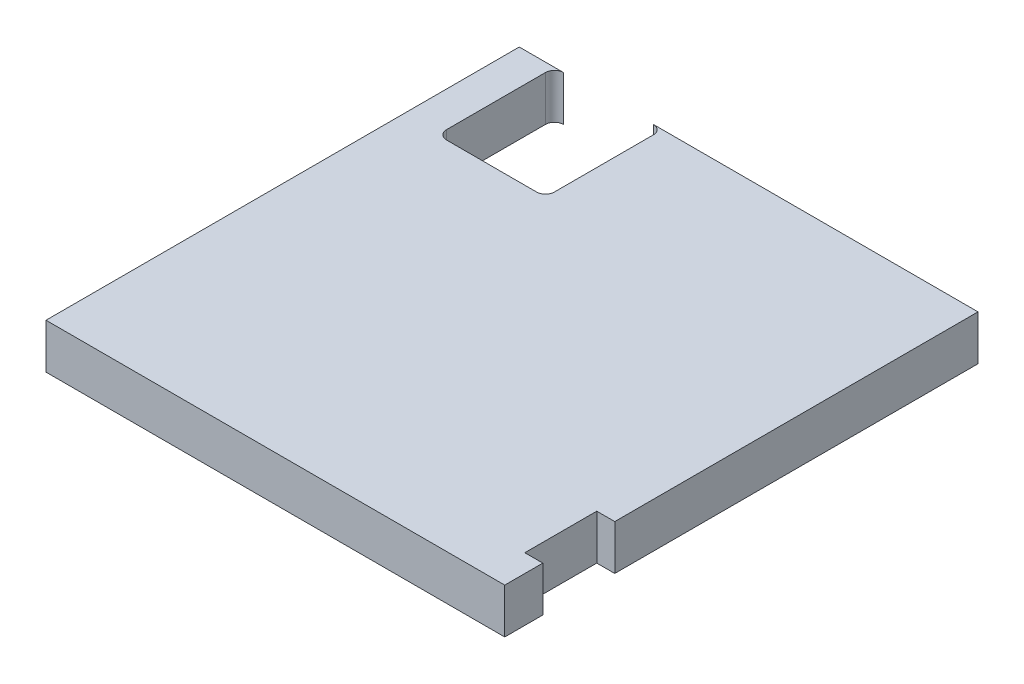
ISO-10303-21;
HEADER;
FILE_DESCRIPTION(('STEP AP214'),'2;1');
FILE_NAME('part.step','',(''),(''),'','','');
FILE_SCHEMA(('AUTOMOTIVE_DESIGN { 1 0 10303 214 1 1 1 1 }'));
ENDSEC;
DATA;
#1=APPLICATION_CONTEXT('core data for automotive mechanical design processes');
#2=APPLICATION_PROTOCOL_DEFINITION('international standard','automotive_design',2000,#1);
#3=PRODUCT_CONTEXT('',#1,'mechanical');
#4=PRODUCT('Part','Part','',(#3));
#5=PRODUCT_RELATED_PRODUCT_CATEGORY('part','',(#4));
#6=PRODUCT_DEFINITION_FORMATION('','',#4);
#7=PRODUCT_DEFINITION_CONTEXT('part definition',#1,'design');
#8=PRODUCT_DEFINITION('design','',#6,#7);
#9=PRODUCT_DEFINITION_SHAPE('','',#8);
#10=(LENGTH_UNIT() NAMED_UNIT(*) SI_UNIT(.MILLI.,.METRE.));
#11=(NAMED_UNIT(*) PLANE_ANGLE_UNIT() SI_UNIT($,.RADIAN.));
#12=(NAMED_UNIT(*) SI_UNIT($,.STERADIAN.) SOLID_ANGLE_UNIT());
#13=UNCERTAINTY_MEASURE_WITH_UNIT(LENGTH_MEASURE(1.E-05),#10,'distance_accuracy_value','');
#14=(GEOMETRIC_REPRESENTATION_CONTEXT(3) GLOBAL_UNCERTAINTY_ASSIGNED_CONTEXT((#13)) GLOBAL_UNIT_ASSIGNED_CONTEXT((#10,
#11,#12)) REPRESENTATION_CONTEXT('',''));
#15=CARTESIAN_POINT('',(0.,0.,0.));
#16=DIRECTION('',(0.,0.,1.));
#17=DIRECTION('',(1.,0.,0.));
#18=AXIS2_PLACEMENT_3D('',#15,#16,#17);
#19=CARTESIAN_POINT('',(0.,0.,-7.61333347303129));
#20=DIRECTION('',(0.,0.,1.));
#21=DIRECTION('',(1.,0.,0.));
#22=AXIS2_PLACEMENT_3D('',#19,#20,#21);
#23=PLANE('',#22);
#24=DIRECTION('',(1.,0.,0.));
#25=VECTOR('',#24,1.);
#26=CARTESIAN_POINT('',(57.5,-23.5,-7.61333347303129));
#27=LINE('',#26,#25);
#28=CARTESIAN_POINT('',(-27.5859247307322,-23.5,-7.61333347303129));
#29=VERTEX_POINT('',#28);
#30=CARTESIAN_POINT('',(8.5,-23.5,-7.61333347303129));
#31=VERTEX_POINT('',#30);
#32=EDGE_CURVE('E200',#29,#31,#27,.T.);
#33=ORIENTED_EDGE('',*,*,#32,.T.);
#34=DIRECTION('',(0.,-1.,0.));
#35=VECTOR('',#34,1.);
#36=CARTESIAN_POINT('',(8.5,0.,-7.61333347303129));
#37=LINE('',#36,#35);
#38=CARTESIAN_POINT('',(8.5,-28.5,-7.61333347303129));
#39=VERTEX_POINT('',#38);
#40=EDGE_CURVE('E37',#31,#39,#37,.T.);
#41=ORIENTED_EDGE('',*,*,#40,.T.);
#42=DIRECTION('',(-1.,0.,0.));
#43=VECTOR('',#42,1.);
#44=CARTESIAN_POINT('',(0.,-28.5,-7.61333347303129));
#45=LINE('',#44,#43);
#46=CARTESIAN_POINT('',(-27.5859247307322,-28.5,-7.61333347303129));
#47=VERTEX_POINT('',#46);
#48=EDGE_CURVE('E163',#39,#47,#45,.T.);
#49=ORIENTED_EDGE('',*,*,#48,.T.);
#50=DIRECTION('',(0.,1.,0.));
#51=VECTOR('',#50,1.);
#52=CARTESIAN_POINT('',(-27.5859247307322,-23.5,-7.61333347303129));
#53=LINE('',#52,#51);
#54=EDGE_CURVE('E151',#47,#29,#53,.T.);
#55=ORIENTED_EDGE('',*,*,#54,.T.);
#56=EDGE_LOOP('',(#33,#41,#49,#55));
#57=FACE_BOUND('',#56,.T.);
#58=ADVANCED_FACE('F33',(#57),#23,.F.);
#59=CARTESIAN_POINT('',(8.5,0.,0.));
#60=DIRECTION('',(-1.,0.,0.));
#61=DIRECTION('',(0.,0.,1.));
#62=AXIS2_PLACEMENT_3D('',#59,#60,#61);
#63=PLANE('',#62);
#64=DIRECTION('',(0.,0.,1.));
#65=VECTOR('',#64,1.);
#66=CARTESIAN_POINT('',(8.5,-23.5,-45.));
#67=LINE('',#66,#65);
#68=CARTESIAN_POINT('',(8.5,-23.5,32.7691840241398));
#69=VERTEX_POINT('',#68);
#70=EDGE_CURVE('E196',#31,#69,#67,.T.);
#71=ORIENTED_EDGE('',*,*,#70,.T.);
#72=DIRECTION('',(0.,-1.,0.));
#73=VECTOR('',#72,1.);
#74=CARTESIAN_POINT('',(8.5,-28.5,32.7691840241398));
#75=LINE('',#74,#73);
#76=CARTESIAN_POINT('',(8.5,-28.5,32.7691840241398));
#77=VERTEX_POINT('',#76);
#78=EDGE_CURVE('E168',#69,#77,#75,.T.);
#79=ORIENTED_EDGE('',*,*,#78,.T.);
#80=DIRECTION('',(0.,0.,-1.));
#81=VECTOR('',#80,1.);
#82=CARTESIAN_POINT('',(8.5,-28.5,0.));
#83=LINE('',#82,#81);
#84=EDGE_CURVE('E230',#77,#39,#83,.T.);
#85=ORIENTED_EDGE('',*,*,#84,.T.);
#86=ORIENTED_EDGE('',*,*,#40,.F.);
#87=EDGE_LOOP('',(#71,#79,#85,#86));
#88=FACE_BOUND('',#87,.T.);
#89=ADVANCED_FACE('F305',(#88),#63,.F.);
#90=CARTESIAN_POINT('',(8.5,-23.5,40.7691840241398));
#91=VERTEX_POINT('',#90);
#92=CARTESIAN_POINT('',(8.5,-23.5,45.));
#93=VERTEX_POINT('',#92);
#94=EDGE_CURVE('E231',#91,#93,#67,.T.);
#95=ORIENTED_EDGE('',*,*,#94,.T.);
#96=DIRECTION('',(0.,-1.,0.));
#97=VECTOR('',#96,1.);
#98=CARTESIAN_POINT('',(8.5,-23.5,45.));
#99=LINE('',#98,#97);
#100=CARTESIAN_POINT('',(8.5,-28.5,45.));
#101=VERTEX_POINT('',#100);
#102=EDGE_CURVE('E197',#93,#101,#99,.T.);
#103=ORIENTED_EDGE('',*,*,#102,.T.);
#104=CARTESIAN_POINT('',(8.5,-28.5,40.7691840241398));
#105=VERTEX_POINT('',#104);
#106=EDGE_CURVE('E193',#101,#105,#83,.T.);
#107=ORIENTED_EDGE('',*,*,#106,.T.);
#108=DIRECTION('',(0.,-1.,0.));
#109=VECTOR('',#108,1.);
#110=CARTESIAN_POINT('',(8.5,-28.5,40.7691840241398));
#111=LINE('',#110,#109);
#112=EDGE_CURVE('E190',#91,#105,#111,.T.);
#113=ORIENTED_EDGE('',*,*,#112,.F.);
#114=EDGE_LOOP('',(#95,#103,#107,#113));
#115=FACE_BOUND('',#114,.T.);
#116=ADVANCED_FACE('F292',(#115),#63,.F.);
#117=DIRECTION('',(0.,1.,0.));
#118=VECTOR('',#117,1.);
#119=CARTESIAN_POINT('',(-37.5859247307322,-28.5,-7.61333347303129));
#120=LINE('',#119,#118);
#121=CARTESIAN_POINT('',(-37.5859247307322,-23.5,-7.61333347303129));
#122=VERTEX_POINT('',#121);
#123=CARTESIAN_POINT('',(-37.5859247307322,-28.5,-7.61333347303129));
#124=VERTEX_POINT('',#123);
#125=EDGE_CURVE('E160',#122,#124,#120,.F.);
#126=ORIENTED_EDGE('',*,*,#125,.T.);
#127=CARTESIAN_POINT('',(-42.5,-28.5,-7.61333347303129));
#128=VERTEX_POINT('',#127);
#129=EDGE_CURVE('E167',#124,#128,#45,.T.);
#130=ORIENTED_EDGE('',*,*,#129,.T.);
#131=DIRECTION('',(0.,1.,0.));
#132=VECTOR('',#131,1.);
#133=CARTESIAN_POINT('',(-42.5,-18.5,-7.61333347303129));
#134=LINE('',#133,#132);
#135=CARTESIAN_POINT('',(-42.5,-23.5,-7.61333347303129));
#136=VERTEX_POINT('',#135);
#137=EDGE_CURVE('E201',#128,#136,#134,.T.);
#138=ORIENTED_EDGE('',*,*,#137,.T.);
#139=EDGE_CURVE('E228',#136,#122,#27,.T.);
#140=ORIENTED_EDGE('',*,*,#139,.T.);
#141=EDGE_LOOP('',(#126,#130,#138,#140));
#142=FACE_BOUND('',#141,.T.);
#143=ADVANCED_FACE('F239',(#142),#23,.F.);
#144=CARTESIAN_POINT('',(0.,-28.5,32.7691840241398));
#145=DIRECTION('',(0.,0.,1.));
#146=DIRECTION('',(1.,0.,0.));
#147=AXIS2_PLACEMENT_3D('',#144,#145,#146);
#148=PLANE('',#147);
#149=ORIENTED_EDGE('',*,*,#78,.F.);
#150=DIRECTION('',(1.,0.,0.));
#151=VECTOR('',#150,1.);
#152=CARTESIAN_POINT('',(0.,-23.5,32.7691840241398));
#153=LINE('',#152,#151);
#154=CARTESIAN_POINT('',(6.5,-23.5,32.7691840241398));
#155=VERTEX_POINT('',#154);
#156=EDGE_CURVE('E205',#155,#69,#153,.T.);
#157=ORIENTED_EDGE('',*,*,#156,.F.);
#158=DIRECTION('',(0.,1.,0.));
#159=VECTOR('',#158,1.);
#160=CARTESIAN_POINT('',(6.5,-28.5,32.7691840241398));
#161=LINE('',#160,#159);
#162=CARTESIAN_POINT('',(6.5,-28.5,32.7691840241398));
#163=VERTEX_POINT('',#162);
#164=EDGE_CURVE('E254',#163,#155,#161,.T.);
#165=ORIENTED_EDGE('',*,*,#164,.F.);
#166=DIRECTION('',(1.,0.,0.));
#167=VECTOR('',#166,1.);
#168=CARTESIAN_POINT('',(0.,-28.5,32.7691840241398));
#169=LINE('',#168,#167);
#170=EDGE_CURVE('E212',#163,#77,#169,.T.);
#171=ORIENTED_EDGE('',*,*,#170,.T.);
#172=EDGE_LOOP('',(#149,#157,#165,#171));
#173=FACE_BOUND('',#172,.T.);
#174=ADVANCED_FACE('F303',(#173),#148,.T.);
#175=CARTESIAN_POINT('',(-37.5859247307322,-28.5,4.38666652696871));
#176=DIRECTION('',(0.,-1.,0.));
#177=DIRECTION('',(0.,0.,-1.));
#178=AXIS2_PLACEMENT_3D('',#175,#176,#177);
#179=CYLINDRICAL_SURFACE('',#178,1.);
#180=CARTESIAN_POINT('',(-37.5859247307322,-28.5,4.38666652696871));
#181=DIRECTION('',(0.,-1.,0.));
#182=DIRECTION('',(0.,0.,-1.));
#183=AXIS2_PLACEMENT_3D('',#180,#181,#182);
#184=CIRCLE('',#183,1.);
#185=CARTESIAN_POINT('',(-38.5859247307322,-28.5,4.38666652696871));
#186=VERTEX_POINT('',#185);
#187=CARTESIAN_POINT('',(-37.5859247307322,-28.5,5.38666652696871));
#188=VERTEX_POINT('',#187);
#189=EDGE_CURVE('E184',#186,#188,#184,.F.);
#190=ORIENTED_EDGE('',*,*,#189,.F.);
#191=DIRECTION('',(0.,1.,0.));
#192=VECTOR('',#191,1.);
#193=CARTESIAN_POINT('',(-38.5859247307322,-28.5,4.38666652696871));
#194=LINE('',#193,#192);
#195=CARTESIAN_POINT('',(-38.5859247307322,-23.5,4.38666652696871));
#196=VERTEX_POINT('',#195);
#197=EDGE_CURVE('E58',#196,#186,#194,.F.);
#198=ORIENTED_EDGE('',*,*,#197,.F.);
#199=CARTESIAN_POINT('',(-37.5859247307322,-23.5,4.38666652696871));
#200=DIRECTION('',(0.,1.,0.));
#201=DIRECTION('',(0.,0.,1.));
#202=AXIS2_PLACEMENT_3D('',#199,#200,#201);
#203=CIRCLE('',#202,1.);
#204=CARTESIAN_POINT('',(-37.5859247307322,-23.5,5.38666652696871));
#205=VERTEX_POINT('',#204);
#206=EDGE_CURVE('E182',#205,#196,#203,.F.);
#207=ORIENTED_EDGE('',*,*,#206,.F.);
#208=DIRECTION('',(0.,1.,0.));
#209=VECTOR('',#208,1.);
#210=CARTESIAN_POINT('',(-37.5859247307322,-23.5,5.38666652696871));
#211=LINE('',#210,#209);
#212=EDGE_CURVE('E270',#188,#205,#211,.T.);
#213=ORIENTED_EDGE('',*,*,#212,.F.);
#214=EDGE_LOOP('',(#190,#198,#207,#213));
#215=FACE_BOUND('',#214,.T.);
#216=ADVANCED_FACE('F319',(#215),#179,.F.);
#217=CARTESIAN_POINT('',(0.,-28.5,5.38666652696871));
#218=DIRECTION('',(0.,0.,1.));
#219=DIRECTION('',(1.,0.,0.));
#220=AXIS2_PLACEMENT_3D('',#217,#218,#219);
#221=PLANE('',#220);
#222=DIRECTION('',(1.,0.,0.));
#223=VECTOR('',#222,1.);
#224=CARTESIAN_POINT('',(0.,-23.5,5.38666652696871));
#225=LINE('',#224,#223);
#226=CARTESIAN_POINT('',(-27.5859247307322,-23.5,5.38666652696871));
#227=VERTEX_POINT('',#226);
#228=EDGE_CURVE('E253',#205,#227,#225,.T.);
#229=ORIENTED_EDGE('',*,*,#228,.T.);
#230=DIRECTION('',(0.,1.,0.));
#231=VECTOR('',#230,1.);
#232=CARTESIAN_POINT('',(-27.5859247307322,-28.5,5.38666652696871));
#233=LINE('',#232,#231);
#234=CARTESIAN_POINT('',(-27.5859247307322,-28.5,5.38666652696871));
#235=VERTEX_POINT('',#234);
#236=EDGE_CURVE('E273',#227,#235,#233,.F.);
#237=ORIENTED_EDGE('',*,*,#236,.T.);
#238=DIRECTION('',(1.,0.,0.));
#239=VECTOR('',#238,1.);
#240=CARTESIAN_POINT('',(0.,-28.5,5.38666652696871));
#241=LINE('',#240,#239);
#242=EDGE_CURVE('E278',#188,#235,#241,.T.);
#243=ORIENTED_EDGE('',*,*,#242,.F.);
#244=ORIENTED_EDGE('',*,*,#212,.T.);
#245=EDGE_LOOP('',(#229,#237,#243,#244));
#246=FACE_BOUND('',#245,.T.);
#247=ADVANCED_FACE('F315',(#246),#221,.F.);
#248=CARTESIAN_POINT('',(-27.5859247307322,-28.5,4.38666652696871));
#249=DIRECTION('',(0.,1.,0.));
#250=DIRECTION('',(0.,0.,1.));
#251=AXIS2_PLACEMENT_3D('',#248,#249,#250);
#252=CYLINDRICAL_SURFACE('',#251,1.);
#253=CARTESIAN_POINT('',(-27.5859247307322,-28.5,4.38666652696871));
#254=DIRECTION('',(0.,-1.,0.));
#255=DIRECTION('',(0.,0.,-1.));
#256=AXIS2_PLACEMENT_3D('',#253,#254,#255);
#257=CIRCLE('',#256,1.);
#258=CARTESIAN_POINT('',(-26.5859247307322,-28.5,4.38666652696871));
#259=VERTEX_POINT('',#258);
#260=EDGE_CURVE('E176',#235,#259,#257,.F.);
#261=ORIENTED_EDGE('',*,*,#260,.F.);
#262=ORIENTED_EDGE('',*,*,#236,.F.);
#263=CARTESIAN_POINT('',(-27.5859247307322,-23.5,4.38666652696871));
#264=DIRECTION('',(0.,1.,0.));
#265=DIRECTION('',(0.,0.,1.));
#266=AXIS2_PLACEMENT_3D('',#263,#264,#265);
#267=CIRCLE('',#266,1.);
#268=CARTESIAN_POINT('',(-26.5859247307322,-23.5,4.38666652696871));
#269=VERTEX_POINT('',#268);
#270=EDGE_CURVE('E174',#269,#227,#267,.F.);
#271=ORIENTED_EDGE('',*,*,#270,.F.);
#272=DIRECTION('',(0.,1.,0.));
#273=VECTOR('',#272,1.);
#274=CARTESIAN_POINT('',(-26.5859247307322,-28.5,4.38666652696871));
#275=LINE('',#274,#273);
#276=EDGE_CURVE('E217',#259,#269,#275,.T.);
#277=ORIENTED_EDGE('',*,*,#276,.F.);
#278=EDGE_LOOP('',(#261,#262,#271,#277));
#279=FACE_BOUND('',#278,.T.);
#280=ADVANCED_FACE('F312',(#279),#252,.F.);
#281=CARTESIAN_POINT('',(-38.5859247307322,-28.5,0.));
#282=DIRECTION('',(-1.,0.,0.));
#283=DIRECTION('',(0.,0.,1.));
#284=AXIS2_PLACEMENT_3D('',#281,#282,#283);
#285=PLANE('',#284);
#286=DIRECTION('',(0.,0.,1.));
#287=VECTOR('',#286,1.);
#288=CARTESIAN_POINT('',(-38.5859247307322,-23.5,0.));
#289=LINE('',#288,#287);
#290=CARTESIAN_POINT('',(-38.5859247307322,-23.5,-6.61333347303129));
#291=VERTEX_POINT('',#290);
#292=EDGE_CURVE('E251',#291,#196,#289,.T.);
#293=ORIENTED_EDGE('',*,*,#292,.T.);
#294=ORIENTED_EDGE('',*,*,#197,.T.);
#295=DIRECTION('',(0.,0.,1.));
#296=VECTOR('',#295,1.);
#297=CARTESIAN_POINT('',(-38.5859247307322,-28.5,0.));
#298=LINE('',#297,#296);
#299=CARTESIAN_POINT('',(-38.5859247307322,-28.5,-6.61333347303129));
#300=VERTEX_POINT('',#299);
#301=EDGE_CURVE('E265',#300,#186,#298,.T.);
#302=ORIENTED_EDGE('',*,*,#301,.F.);
#303=DIRECTION('',(0.,1.,0.));
#304=VECTOR('',#303,1.);
#305=CARTESIAN_POINT('',(-38.5859247307322,-28.5,-6.61333347303129));
#306=LINE('',#305,#304);
#307=EDGE_CURVE('E275',#300,#291,#306,.T.);
#308=ORIENTED_EDGE('',*,*,#307,.T.);
#309=EDGE_LOOP('',(#293,#294,#302,#308));
#310=FACE_BOUND('',#309,.T.);
#311=ADVANCED_FACE('F276',(#310),#285,.F.);
#312=CARTESIAN_POINT('',(-26.5859247307322,-28.5,0.));
#313=DIRECTION('',(-1.,0.,0.));
#314=DIRECTION('',(0.,0.,1.));
#315=AXIS2_PLACEMENT_3D('',#312,#313,#314);
#316=PLANE('',#315);
#317=DIRECTION('',(0.,0.,1.));
#318=VECTOR('',#317,1.);
#319=CARTESIAN_POINT('',(-26.5859247307322,-23.5,0.));
#320=LINE('',#319,#318);
#321=CARTESIAN_POINT('',(-26.5859247307322,-23.5,-6.61333347303129));
#322=VERTEX_POINT('',#321);
#323=EDGE_CURVE('E257',#322,#269,#320,.T.);
#324=ORIENTED_EDGE('',*,*,#323,.F.);
#325=DIRECTION('',(0.,1.,0.));
#326=VECTOR('',#325,1.);
#327=CARTESIAN_POINT('',(-26.5859247307322,-28.5,-6.61333347303129));
#328=LINE('',#327,#326);
#329=CARTESIAN_POINT('',(-26.5859247307322,-28.5,-6.61333347303129));
#330=VERTEX_POINT('',#329);
#331=EDGE_CURVE('E268',#322,#330,#328,.F.);
#332=ORIENTED_EDGE('',*,*,#331,.T.);
#333=DIRECTION('',(0.,0.,1.));
#334=VECTOR('',#333,1.);
#335=CARTESIAN_POINT('',(-26.5859247307322,-28.5,0.));
#336=LINE('',#335,#334);
#337=EDGE_CURVE('E173',#330,#259,#336,.T.);
#338=ORIENTED_EDGE('',*,*,#337,.T.);
#339=ORIENTED_EDGE('',*,*,#276,.T.);
#340=EDGE_LOOP('',(#324,#332,#338,#339));
#341=FACE_BOUND('',#340,.T.);
#342=ADVANCED_FACE('F308',(#341),#316,.T.);
#343=CARTESIAN_POINT('',(6.5,-28.5,0.));
#344=DIRECTION('',(-1.,0.,0.));
#345=DIRECTION('',(0.,0.,1.));
#346=AXIS2_PLACEMENT_3D('',#343,#344,#345);
#347=PLANE('',#346);
#348=DIRECTION('',(0.,0.,1.));
#349=VECTOR('',#348,1.);
#350=CARTESIAN_POINT('',(6.5,-23.5,0.));
#351=LINE('',#350,#349);
#352=CARTESIAN_POINT('',(6.5,-23.5,40.7691840241398));
#353=VERTEX_POINT('',#352);
#354=EDGE_CURVE('E192',#155,#353,#351,.T.);
#355=ORIENTED_EDGE('',*,*,#354,.T.);
#356=DIRECTION('',(0.,1.,0.));
#357=VECTOR('',#356,1.);
#358=CARTESIAN_POINT('',(6.5,-28.5,40.7691840241398));
#359=LINE('',#358,#357);
#360=CARTESIAN_POINT('',(6.5,-28.5,40.7691840241398));
#361=VERTEX_POINT('',#360);
#362=EDGE_CURVE('E215',#361,#353,#359,.T.);
#363=ORIENTED_EDGE('',*,*,#362,.F.);
#364=DIRECTION('',(0.,0.,1.));
#365=VECTOR('',#364,1.);
#366=CARTESIAN_POINT('',(6.5,-28.5,0.));
#367=LINE('',#366,#365);
#368=EDGE_CURVE('E208',#163,#361,#367,.T.);
#369=ORIENTED_EDGE('',*,*,#368,.F.);
#370=ORIENTED_EDGE('',*,*,#164,.T.);
#371=EDGE_LOOP('',(#355,#363,#369,#370));
#372=FACE_BOUND('',#371,.T.);
#373=ADVANCED_FACE('F301',(#372),#347,.F.);
#374=CARTESIAN_POINT('',(57.5,-23.5,-45.));
#375=DIRECTION('',(0.,1.,0.));
#376=DIRECTION('',(0.,0.,1.));
#377=AXIS2_PLACEMENT_3D('',#374,#375,#376);
#378=PLANE('',#377);
#379=ORIENTED_EDGE('',*,*,#70,.F.);
#380=ORIENTED_EDGE('',*,*,#32,.F.);
#381=CARTESIAN_POINT('',(-27.5859247307322,-23.5,-6.61333347303129));
#382=DIRECTION('',(0.,1.,0.));
#383=DIRECTION('',(0.,0.,1.));
#384=AXIS2_PLACEMENT_3D('',#381,#382,#383);
#385=CIRCLE('',#384,1.);
#386=EDGE_CURVE('E157',#29,#322,#385,.F.);
#387=ORIENTED_EDGE('',*,*,#386,.T.);
#388=ORIENTED_EDGE('',*,*,#323,.T.);
#389=ORIENTED_EDGE('',*,*,#270,.T.);
#390=ORIENTED_EDGE('',*,*,#228,.F.);
#391=ORIENTED_EDGE('',*,*,#206,.T.);
#392=ORIENTED_EDGE('',*,*,#292,.F.);
#393=CARTESIAN_POINT('',(-37.5859247307322,-23.5,-6.61333347303129));
#394=DIRECTION('',(0.,1.,0.));
#395=DIRECTION('',(0.,0.,1.));
#396=AXIS2_PLACEMENT_3D('',#393,#394,#395);
#397=CIRCLE('',#396,1.);
#398=EDGE_CURVE('E186',#291,#122,#397,.F.);
#399=ORIENTED_EDGE('',*,*,#398,.T.);
#400=ORIENTED_EDGE('',*,*,#139,.F.);
#401=DIRECTION('',(0.,0.,-1.));
#402=VECTOR('',#401,1.);
#403=CARTESIAN_POINT('',(-42.5,-23.5,-45.));
#404=LINE('',#403,#402);
#405=CARTESIAN_POINT('',(-42.5,-23.5,45.));
#406=VERTEX_POINT('',#405);
#407=EDGE_CURVE('E218',#406,#136,#404,.T.);
#408=ORIENTED_EDGE('',*,*,#407,.F.);
#409=DIRECTION('',(-1.,0.,0.));
#410=VECTOR('',#409,1.);
#411=CARTESIAN_POINT('',(57.5,-23.5,45.));
#412=LINE('',#411,#410);
#413=EDGE_CURVE('E216',#93,#406,#412,.T.);
#414=ORIENTED_EDGE('',*,*,#413,.F.);
#415=ORIENTED_EDGE('',*,*,#94,.F.);
#416=DIRECTION('',(1.,0.,0.));
#417=VECTOR('',#416,1.);
#418=CARTESIAN_POINT('',(0.,-23.5,40.7691840241398));
#419=LINE('',#418,#417);
#420=EDGE_CURVE('E202',#353,#91,#419,.T.);
#421=ORIENTED_EDGE('',*,*,#420,.F.);
#422=ORIENTED_EDGE('',*,*,#354,.F.);
#423=ORIENTED_EDGE('',*,*,#156,.T.);
#424=EDGE_LOOP('',(#379,#380,#387,#388,#389,#390,#391,#392,#399,#400,#408,#414,#415,#421,#422,#423));
#425=FACE_BOUND('',#424,.T.);
#426=ADVANCED_FACE('F250',(#425),#378,.T.);
#427=CARTESIAN_POINT('',(57.5,-23.5,45.));
#428=DIRECTION('',(0.,0.,1.));
#429=DIRECTION('',(0.,-1.,0.));
#430=AXIS2_PLACEMENT_3D('',#427,#428,#429);
#431=PLANE('',#430);
#432=ORIENTED_EDGE('',*,*,#102,.F.);
#433=ORIENTED_EDGE('',*,*,#413,.T.);
#434=DIRECTION('',(0.,1.,0.));
#435=VECTOR('',#434,1.);
#436=CARTESIAN_POINT('',(-42.5,-23.5,45.));
#437=LINE('',#436,#435);
#438=CARTESIAN_POINT('',(-42.5,-28.5,45.));
#439=VERTEX_POINT('',#438);
#440=EDGE_CURVE('E224',#439,#406,#437,.T.);
#441=ORIENTED_EDGE('',*,*,#440,.F.);
#442=DIRECTION('',(1.,0.,0.));
#443=VECTOR('',#442,1.);
#444=CARTESIAN_POINT('',(57.5,-28.5,45.));
#445=LINE('',#444,#443);
#446=EDGE_CURVE('E11',#439,#101,#445,.T.);
#447=ORIENTED_EDGE('',*,*,#446,.T.);
#448=EDGE_LOOP('',(#432,#433,#441,#447));
#449=FACE_BOUND('',#448,.T.);
#450=ADVANCED_FACE('F290',(#449),#431,.T.);
#451=CARTESIAN_POINT('',(0.,-28.5,0.));
#452=DIRECTION('',(0.,-1.,0.));
#453=DIRECTION('',(0.,0.,-1.));
#454=AXIS2_PLACEMENT_3D('',#451,#452,#453);
#455=PLANE('',#454);
#456=ORIENTED_EDGE('',*,*,#106,.F.);
#457=ORIENTED_EDGE('',*,*,#446,.F.);
#458=DIRECTION('',(0.,0.,1.));
#459=VECTOR('',#458,1.);
#460=CARTESIAN_POINT('',(-42.5,-28.5,-45.));
#461=LINE('',#460,#459);
#462=EDGE_CURVE('E50',#128,#439,#461,.T.);
#463=ORIENTED_EDGE('',*,*,#462,.F.);
#464=ORIENTED_EDGE('',*,*,#129,.F.);
#465=CARTESIAN_POINT('',(-37.5859247307322,-28.5,-6.61333347303129));
#466=DIRECTION('',(0.,-1.,0.));
#467=DIRECTION('',(0.,0.,-1.));
#468=AXIS2_PLACEMENT_3D('',#465,#466,#467);
#469=CIRCLE('',#468,1.);
#470=EDGE_CURVE('E42',#124,#300,#469,.F.);
#471=ORIENTED_EDGE('',*,*,#470,.T.);
#472=ORIENTED_EDGE('',*,*,#301,.T.);
#473=ORIENTED_EDGE('',*,*,#189,.T.);
#474=ORIENTED_EDGE('',*,*,#242,.T.);
#475=ORIENTED_EDGE('',*,*,#260,.T.);
#476=ORIENTED_EDGE('',*,*,#337,.F.);
#477=CARTESIAN_POINT('',(-27.5859247307322,-28.5,-6.61333347303129));
#478=DIRECTION('',(0.,-1.,0.));
#479=DIRECTION('',(0.,0.,-1.));
#480=AXIS2_PLACEMENT_3D('',#477,#478,#479);
#481=CIRCLE('',#480,1.);
#482=EDGE_CURVE('E156',#330,#47,#481,.F.);
#483=ORIENTED_EDGE('',*,*,#482,.T.);
#484=ORIENTED_EDGE('',*,*,#48,.F.);
#485=ORIENTED_EDGE('',*,*,#84,.F.);
#486=ORIENTED_EDGE('',*,*,#170,.F.);
#487=ORIENTED_EDGE('',*,*,#368,.T.);
#488=DIRECTION('',(1.,0.,0.));
#489=VECTOR('',#488,1.);
#490=CARTESIAN_POINT('',(0.,-28.5,40.7691840241398));
#491=LINE('',#490,#489);
#492=EDGE_CURVE('E209',#361,#105,#491,.T.);
#493=ORIENTED_EDGE('',*,*,#492,.T.);
#494=EDGE_LOOP('',(#456,#457,#463,#464,#471,#472,#473,#474,#475,#476,#483,#484,#485,#486,#487,#493));
#495=FACE_BOUND('',#494,.T.);
#496=ADVANCED_FACE('F171',(#495),#455,.T.);
#497=CARTESIAN_POINT('',(-42.5,-18.5,0.));
#498=DIRECTION('',(-1.,0.,0.));
#499=DIRECTION('',(0.,0.,1.));
#500=AXIS2_PLACEMENT_3D('',#497,#498,#499);
#501=PLANE('',#500);
#502=ORIENTED_EDGE('',*,*,#137,.F.);
#503=ORIENTED_EDGE('',*,*,#462,.T.);
#504=ORIENTED_EDGE('',*,*,#440,.T.);
#505=ORIENTED_EDGE('',*,*,#407,.T.);
#506=EDGE_LOOP('',(#502,#503,#504,#505));
#507=FACE_BOUND('',#506,.T.);
#508=ADVANCED_FACE('F35',(#507),#501,.T.);
#509=CARTESIAN_POINT('',(0.,-28.5,40.7691840241398));
#510=DIRECTION('',(0.,0.,1.));
#511=DIRECTION('',(1.,0.,0.));
#512=AXIS2_PLACEMENT_3D('',#509,#510,#511);
#513=PLANE('',#512);
#514=ORIENTED_EDGE('',*,*,#420,.T.);
#515=ORIENTED_EDGE('',*,*,#112,.T.);
#516=ORIENTED_EDGE('',*,*,#492,.F.);
#517=ORIENTED_EDGE('',*,*,#362,.T.);
#518=EDGE_LOOP('',(#514,#515,#516,#517));
#519=FACE_BOUND('',#518,.T.);
#520=ADVANCED_FACE('F297',(#519),#513,.F.);
#521=CARTESIAN_POINT('',(-27.5859247307322,-28.5,-6.61333347303129));
#522=DIRECTION('',(0.,-1.,0.));
#523=DIRECTION('',(0.,0.,-1.));
#524=AXIS2_PLACEMENT_3D('',#521,#522,#523);
#525=CYLINDRICAL_SURFACE('',#524,1.);
#526=ORIENTED_EDGE('',*,*,#482,.F.);
#527=ORIENTED_EDGE('',*,*,#331,.F.);
#528=ORIENTED_EDGE('',*,*,#386,.F.);
#529=ORIENTED_EDGE('',*,*,#54,.F.);
#530=EDGE_LOOP('',(#526,#527,#528,#529));
#531=FACE_BOUND('',#530,.T.);
#532=ADVANCED_FACE('F153',(#531),#525,.F.);
#533=CARTESIAN_POINT('',(-37.5859247307322,-28.5,-6.61333347303129));
#534=DIRECTION('',(0.,1.,0.));
#535=DIRECTION('',(0.,0.,1.));
#536=AXIS2_PLACEMENT_3D('',#533,#534,#535);
#537=CYLINDRICAL_SURFACE('',#536,1.);
#538=ORIENTED_EDGE('',*,*,#470,.F.);
#539=ORIENTED_EDGE('',*,*,#125,.F.);
#540=ORIENTED_EDGE('',*,*,#398,.F.);
#541=ORIENTED_EDGE('',*,*,#307,.F.);
#542=EDGE_LOOP('',(#538,#539,#540,#541));
#543=FACE_BOUND('',#542,.T.);
#544=ADVANCED_FACE('F245',(#543),#537,.F.);
#545=CLOSED_SHELL('',(#58,#89,#116,#143,#174,#216,#247,#280,#311,#342,#373,#426,#450,#496,#508,
#520,#532,#544));
#546=MANIFOLD_SOLID_BREP('B2',#545);
#547=ADVANCED_BREP_SHAPE_REPRESENTATION('',(#18,#546),#14);
#548=SHAPE_DEFINITION_REPRESENTATION(#9,#547);
ENDSEC;
END-ISO-10303-21;
